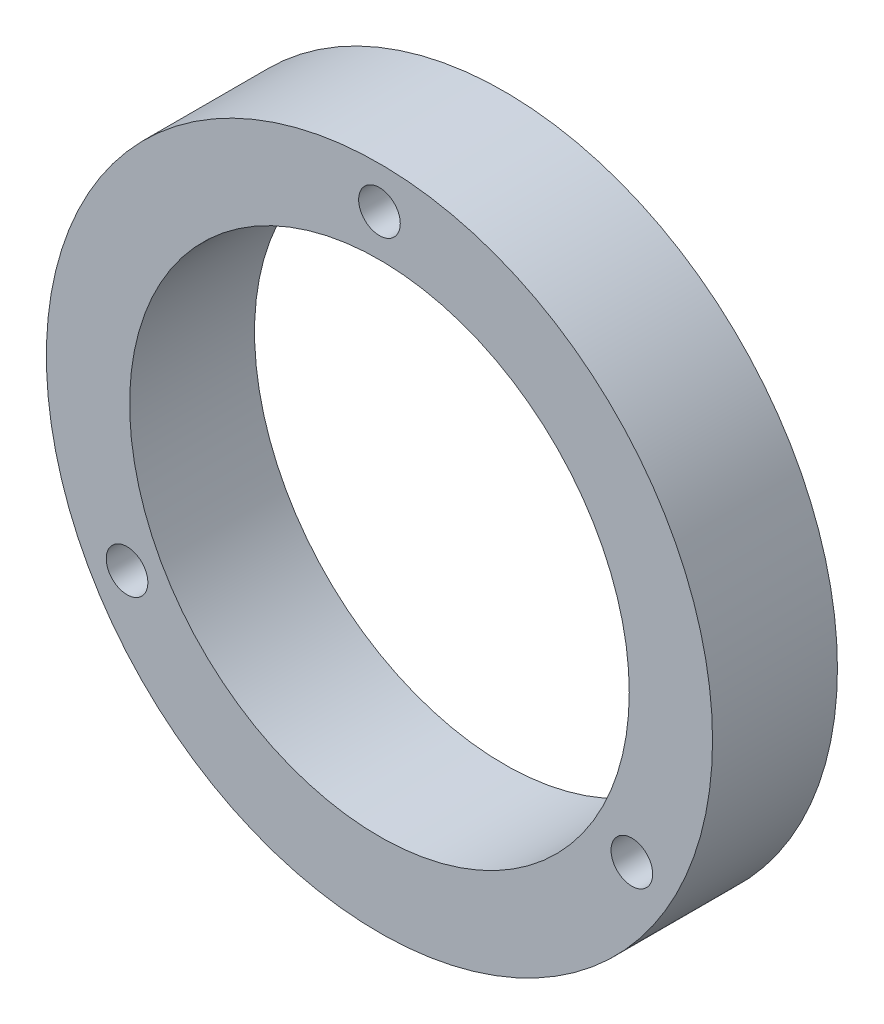
ISO-10303-21;
HEADER;
FILE_DESCRIPTION(('STEP AP214'),'2;1');
FILE_NAME('part.step','',(''),(''),'','','');
FILE_SCHEMA(('AUTOMOTIVE_DESIGN { 1 0 10303 214 1 1 1 1 }'));
ENDSEC;
DATA;
#1=APPLICATION_CONTEXT('core data for automotive mechanical design processes');
#2=APPLICATION_PROTOCOL_DEFINITION('international standard','automotive_design',2000,#1);
#3=PRODUCT_CONTEXT('',#1,'mechanical');
#4=PRODUCT('Part','Part','',(#3));
#5=PRODUCT_RELATED_PRODUCT_CATEGORY('part','',(#4));
#6=PRODUCT_DEFINITION_FORMATION('','',#4);
#7=PRODUCT_DEFINITION_CONTEXT('part definition',#1,'design');
#8=PRODUCT_DEFINITION('design','',#6,#7);
#9=PRODUCT_DEFINITION_SHAPE('','',#8);
#10=(LENGTH_UNIT() NAMED_UNIT(*) SI_UNIT(.MILLI.,.METRE.));
#11=(NAMED_UNIT(*) PLANE_ANGLE_UNIT() SI_UNIT($,.RADIAN.));
#12=(NAMED_UNIT(*) SI_UNIT($,.STERADIAN.) SOLID_ANGLE_UNIT());
#13=UNCERTAINTY_MEASURE_WITH_UNIT(LENGTH_MEASURE(1.E-05),#10,'distance_accuracy_value','');
#14=(GEOMETRIC_REPRESENTATION_CONTEXT(3) GLOBAL_UNCERTAINTY_ASSIGNED_CONTEXT((#13)) GLOBAL_UNIT_ASSIGNED_CONTEXT((#10,
#11,#12)) REPRESENTATION_CONTEXT('',''));
#15=CARTESIAN_POINT('',(0.,0.,0.));
#16=DIRECTION('',(0.,0.,1.));
#17=DIRECTION('',(1.,0.,0.));
#18=AXIS2_PLACEMENT_3D('',#15,#16,#17);
#19=CARTESIAN_POINT('',(0.,0.,33.5));
#20=DIRECTION('',(0.,0.,1.));
#21=DIRECTION('',(1.,0.,0.));
#22=AXIS2_PLACEMENT_3D('',#19,#20,#21);
#23=CYLINDRICAL_SURFACE('',#22,7.99999999999988);
#24=CARTESIAN_POINT('',(0.,0.,33.5));
#25=DIRECTION('',(0.,0.,1.));
#26=DIRECTION('',(1.,0.,0.));
#27=AXIS2_PLACEMENT_3D('',#24,#25,#26);
#28=CIRCLE('',#27,7.99999999999988);
#29=CARTESIAN_POINT('',(7.99999999999988,0.,33.5));
#30=VERTEX_POINT('',#29);
#31=EDGE_CURVE('E10',#30,#30,#28,.T.);
#32=ORIENTED_EDGE('',*,*,#31,.T.);
#33=EDGE_LOOP('',(#32));
#34=FACE_BOUND('',#33,.T.);
#35=CARTESIAN_POINT('',(0.,0.,36.5));
#36=DIRECTION('',(0.,0.,1.));
#37=DIRECTION('',(1.,0.,0.));
#38=AXIS2_PLACEMENT_3D('',#35,#36,#37);
#39=CIRCLE('',#38,7.99999999999988);
#40=CARTESIAN_POINT('',(7.99999999999988,0.,36.5));
#41=VERTEX_POINT('',#40);
#42=EDGE_CURVE('E42',#41,#41,#39,.T.);
#43=ORIENTED_EDGE('',*,*,#42,.F.);
#44=EDGE_LOOP('',(#43));
#45=FACE_BOUND('',#44,.T.);
#46=ADVANCED_FACE('F39',(#34,#45),#23,.T.);
#47=CARTESIAN_POINT('',(0.,0.,33.5));
#48=DIRECTION('',(0.,0.,1.));
#49=DIRECTION('',(1.,0.,0.));
#50=AXIS2_PLACEMENT_3D('',#47,#48,#49);
#51=PLANE('',#50);
#52=CARTESIAN_POINT('',(-6.06217782649095,-3.49999999999997,33.5));
#53=DIRECTION('',(0.,0.,1.));
#54=DIRECTION('',(1.,0.,0.));
#55=AXIS2_PLACEMENT_3D('',#52,#53,#54);
#56=CIRCLE('',#55,0.5);
#57=CARTESIAN_POINT('',(-5.56217782649095,-3.49999999999997,33.5));
#58=VERTEX_POINT('',#57);
#59=EDGE_CURVE('E62',#58,#58,#56,.F.);
#60=ORIENTED_EDGE('',*,*,#59,.F.);
#61=EDGE_LOOP('',(#60));
#62=FACE_BOUND('',#61,.T.);
#63=CARTESIAN_POINT('',(6.062177826491,-3.49999999999988,33.5));
#64=DIRECTION('',(0.,0.,1.));
#65=DIRECTION('',(1.,0.,0.));
#66=AXIS2_PLACEMENT_3D('',#63,#64,#65);
#67=CIRCLE('',#66,0.5);
#68=CARTESIAN_POINT('',(6.562177826491,-3.49999999999988,33.5));
#69=VERTEX_POINT('',#68);
#70=EDGE_CURVE('E63',#69,#69,#67,.F.);
#71=ORIENTED_EDGE('',*,*,#70,.F.);
#72=EDGE_LOOP('',(#71));
#73=FACE_BOUND('',#72,.T.);
#74=CARTESIAN_POINT('',(0.,6.99999999999988,33.5));
#75=DIRECTION('',(0.,0.,1.));
#76=DIRECTION('',(1.,0.,0.));
#77=AXIS2_PLACEMENT_3D('',#74,#75,#76);
#78=CIRCLE('',#77,0.5);
#79=CARTESIAN_POINT('',(0.5,6.99999999999988,33.5));
#80=VERTEX_POINT('',#79);
#81=EDGE_CURVE('E54',#80,#80,#78,.F.);
#82=ORIENTED_EDGE('',*,*,#81,.F.);
#83=EDGE_LOOP('',(#82));
#84=FACE_BOUND('',#83,.T.);
#85=CARTESIAN_POINT('',(0.,0.,33.5));
#86=DIRECTION('',(0.,0.,1.));
#87=DIRECTION('',(1.,0.,0.));
#88=AXIS2_PLACEMENT_3D('',#85,#86,#87);
#89=CIRCLE('',#88,5.99999999999988);
#90=CARTESIAN_POINT('',(5.99999999999988,0.,33.5));
#91=VERTEX_POINT('',#90);
#92=EDGE_CURVE('E49',#91,#91,#89,.T.);
#93=ORIENTED_EDGE('',*,*,#92,.T.);
#94=EDGE_LOOP('',(#93));
#95=FACE_BOUND('',#94,.T.);
#96=ORIENTED_EDGE('',*,*,#31,.F.);
#97=EDGE_LOOP('',(#96));
#98=FACE_BOUND('',#97,.T.);
#99=ADVANCED_FACE('F81',(#62,#73,#84,#95,#98),#51,.F.);
#100=CARTESIAN_POINT('',(0.,0.,36.5));
#101=DIRECTION('',(0.,0.,1.));
#102=DIRECTION('',(1.,0.,0.));
#103=AXIS2_PLACEMENT_3D('',#100,#101,#102);
#104=PLANE('',#103);
#105=CARTESIAN_POINT('',(-6.06217782649095,-3.49999999999997,36.5));
#106=DIRECTION('',(0.,0.,1.));
#107=DIRECTION('',(-0.500000000000004,0.866025403784436,0.));
#108=AXIS2_PLACEMENT_3D('',#105,#106,#107);
#109=CIRCLE('',#108,0.5);
#110=CARTESIAN_POINT('',(-6.31217782649095,-3.06698729810775,36.5));
#111=VERTEX_POINT('',#110);
#112=EDGE_CURVE('E66',#111,#111,#109,.T.);
#113=ORIENTED_EDGE('',*,*,#112,.F.);
#114=EDGE_LOOP('',(#113));
#115=FACE_BOUND('',#114,.T.);
#116=CARTESIAN_POINT('',(6.062177826491,-3.49999999999988,36.5));
#117=DIRECTION('',(0.,0.,1.));
#118=DIRECTION('',(-0.499999999999992,-0.866025403784443,0.));
#119=AXIS2_PLACEMENT_3D('',#116,#117,#118);
#120=CIRCLE('',#119,0.5);
#121=CARTESIAN_POINT('',(5.812177826491,-3.9330127018921,36.5));
#122=VERTEX_POINT('',#121);
#123=EDGE_CURVE('E67',#122,#122,#120,.T.);
#124=ORIENTED_EDGE('',*,*,#123,.F.);
#125=EDGE_LOOP('',(#124));
#126=FACE_BOUND('',#125,.T.);
#127=CARTESIAN_POINT('',(0.,6.99999999999988,36.5));
#128=DIRECTION('',(0.,0.,1.));
#129=DIRECTION('',(1.,0.,0.));
#130=AXIS2_PLACEMENT_3D('',#127,#128,#129);
#131=CIRCLE('',#130,0.5);
#132=CARTESIAN_POINT('',(0.5,6.99999999999988,36.5));
#133=VERTEX_POINT('',#132);
#134=EDGE_CURVE('E59',#133,#133,#131,.T.);
#135=ORIENTED_EDGE('',*,*,#134,.F.);
#136=EDGE_LOOP('',(#135));
#137=FACE_BOUND('',#136,.T.);
#138=CARTESIAN_POINT('',(0.,0.,36.5));
#139=DIRECTION('',(0.,0.,1.));
#140=DIRECTION('',(1.,0.,0.));
#141=AXIS2_PLACEMENT_3D('',#138,#139,#140);
#142=CIRCLE('',#141,5.99999999999988);
#143=CARTESIAN_POINT('',(5.99999999999988,0.,36.5));
#144=VERTEX_POINT('',#143);
#145=EDGE_CURVE('E51',#144,#144,#142,.T.);
#146=ORIENTED_EDGE('',*,*,#145,.F.);
#147=EDGE_LOOP('',(#146));
#148=FACE_BOUND('',#147,.T.);
#149=ORIENTED_EDGE('',*,*,#42,.T.);
#150=EDGE_LOOP('',(#149));
#151=FACE_BOUND('',#150,.T.);
#152=ADVANCED_FACE('F77',(#115,#126,#137,#148,#151),#104,.T.);
#153=CARTESIAN_POINT('',(0.,0.,33.5));
#154=DIRECTION('',(0.,0.,1.));
#155=DIRECTION('',(1.,0.,0.));
#156=AXIS2_PLACEMENT_3D('',#153,#154,#155);
#157=CYLINDRICAL_SURFACE('',#156,5.99999999999988);
#158=ORIENTED_EDGE('',*,*,#92,.F.);
#159=EDGE_LOOP('',(#158));
#160=FACE_BOUND('',#159,.T.);
#161=ORIENTED_EDGE('',*,*,#145,.T.);
#162=EDGE_LOOP('',(#161));
#163=FACE_BOUND('',#162,.T.);
#164=ADVANCED_FACE('F80',(#160,#163),#157,.F.);
#165=CARTESIAN_POINT('',(0.,6.99999999999988,32.0857864376269));
#166=DIRECTION('',(0.,0.,1.));
#167=DIRECTION('',(1.,0.,0.));
#168=AXIS2_PLACEMENT_3D('',#165,#166,#167);
#169=CYLINDRICAL_SURFACE('',#168,0.5);
#170=ORIENTED_EDGE('',*,*,#81,.T.);
#171=EDGE_LOOP('',(#170));
#172=FACE_BOUND('',#171,.T.);
#173=ORIENTED_EDGE('',*,*,#134,.T.);
#174=EDGE_LOOP('',(#173));
#175=FACE_BOUND('',#174,.T.);
#176=ADVANCED_FACE('F105',(#172,#175),#169,.F.);
#177=CARTESIAN_POINT('',(6.062177826491,-3.49999999999988,32.0857864376269));
#178=DIRECTION('',(0.,0.,1.));
#179=DIRECTION('',(1.,0.,0.));
#180=AXIS2_PLACEMENT_3D('',#177,#178,#179);
#181=CYLINDRICAL_SURFACE('',#180,0.5);
#182=ORIENTED_EDGE('',*,*,#70,.T.);
#183=EDGE_LOOP('',(#182));
#184=FACE_BOUND('',#183,.T.);
#185=ORIENTED_EDGE('',*,*,#123,.T.);
#186=EDGE_LOOP('',(#185));
#187=FACE_BOUND('',#186,.T.);
#188=ADVANCED_FACE('F108',(#184,#187),#181,.F.);
#189=CARTESIAN_POINT('',(-6.06217782649095,-3.49999999999997,32.0857864376269));
#190=DIRECTION('',(0.,0.,1.));
#191=DIRECTION('',(1.,0.,0.));
#192=AXIS2_PLACEMENT_3D('',#189,#190,#191);
#193=CYLINDRICAL_SURFACE('',#192,0.5);
#194=ORIENTED_EDGE('',*,*,#59,.T.);
#195=EDGE_LOOP('',(#194));
#196=FACE_BOUND('',#195,.T.);
#197=ORIENTED_EDGE('',*,*,#112,.T.);
#198=EDGE_LOOP('',(#197));
#199=FACE_BOUND('',#198,.T.);
#200=ADVANCED_FACE('F75',(#196,#199),#193,.F.);
#201=CLOSED_SHELL('',(#46,#99,#152,#164,#176,#188,#200));
#202=MANIFOLD_SOLID_BREP('B2',#201);
#203=ADVANCED_BREP_SHAPE_REPRESENTATION('',(#18,#202),#14);
#204=SHAPE_DEFINITION_REPRESENTATION(#9,#203);
ENDSEC;
END-ISO-10303-21;
